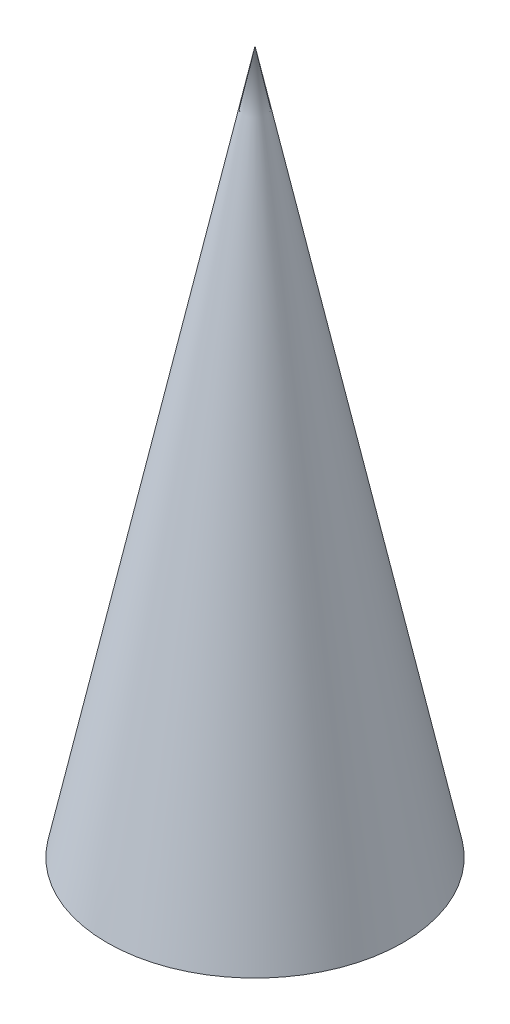
ISO-10303-21;
HEADER;
FILE_DESCRIPTION(('STEP AP214'),'2;1');
FILE_NAME('part.step','',(''),(''),'','','');
FILE_SCHEMA(('AUTOMOTIVE_DESIGN { 1 0 10303 214 1 1 1 1 }'));
ENDSEC;
DATA;
#1=APPLICATION_CONTEXT('core data for automotive mechanical design processes');
#2=APPLICATION_PROTOCOL_DEFINITION('international standard','automotive_design',2000,#1);
#3=PRODUCT_CONTEXT('',#1,'mechanical');
#4=PRODUCT('Part','Part','',(#3));
#5=PRODUCT_RELATED_PRODUCT_CATEGORY('part','',(#4));
#6=PRODUCT_DEFINITION_FORMATION('','',#4);
#7=PRODUCT_DEFINITION_CONTEXT('part definition',#1,'design');
#8=PRODUCT_DEFINITION('design','',#6,#7);
#9=PRODUCT_DEFINITION_SHAPE('','',#8);
#10=(LENGTH_UNIT() NAMED_UNIT(*) SI_UNIT(.MILLI.,.METRE.));
#11=(NAMED_UNIT(*) PLANE_ANGLE_UNIT() SI_UNIT($,.RADIAN.));
#12=(NAMED_UNIT(*) SI_UNIT($,.STERADIAN.) SOLID_ANGLE_UNIT());
#13=UNCERTAINTY_MEASURE_WITH_UNIT(LENGTH_MEASURE(1.E-05),#10,'distance_accuracy_value','');
#14=(GEOMETRIC_REPRESENTATION_CONTEXT(3) GLOBAL_UNCERTAINTY_ASSIGNED_CONTEXT((#13)) GLOBAL_UNIT_ASSIGNED_CONTEXT((#10,
#11,#12)) REPRESENTATION_CONTEXT('',''));
#15=CARTESIAN_POINT('',(0.,0.,0.));
#16=DIRECTION('',(0.,0.,1.));
#17=DIRECTION('',(1.,0.,0.));
#18=AXIS2_PLACEMENT_3D('',#15,#16,#17);
#19=CARTESIAN_POINT('',(0.,0.,0.));
#20=DIRECTION('',(0.,1.,0.));
#21=DIRECTION('',(0.,0.,1.));
#22=AXIS2_PLACEMENT_3D('',#19,#20,#21);
#23=PLANE('',#22);
#24=CARTESIAN_POINT('',(0.,0.,0.));
#25=DIRECTION('',(0.,1.,0.));
#26=DIRECTION('',(0.,0.,1.));
#27=AXIS2_PLACEMENT_3D('',#24,#25,#26);
#28=CIRCLE('',#27,40.);
#29=CARTESIAN_POINT('',(0.,0.,40.));
#30=VERTEX_POINT('',#29);
#31=EDGE_CURVE('E11',#30,#30,#28,.T.);
#32=ORIENTED_EDGE('',*,*,#31,.F.);
#33=EDGE_LOOP('',(#32));
#34=FACE_BOUND('',#33,.T.);
#35=ADVANCED_FACE('F30',(#34),#23,.F.);
#36=CARTESIAN_POINT('',(0.,-3.44169137633799E-12,0.));
#37=DIRECTION('',(0.,-1.,0.));
#38=DIRECTION('',(0.,0.,-1.));
#39=AXIS2_PLACEMENT_3D('',#36,#37,#38);
#40=CONICAL_SURFACE('',#39,40.0000000000001,0.207496226435199);
#41=ORIENTED_EDGE('',*,*,#31,.T.);
#42=EDGE_LOOP('',(#41));
#43=FACE_BOUND('',#42,.T.);
#44=CARTESIAN_POINT('',(0.,190.,0.));
#45=VERTEX_POINT('',#44);
#46=VERTEX_LOOP('',#45);
#47=FACE_BOUND('',#46,.T.);
#48=ADVANCED_FACE('F32',(#43,#47),#40,.T.);
#49=CLOSED_SHELL('',(#35,#48));
#50=MANIFOLD_SOLID_BREP('B2',#49);
#51=ADVANCED_BREP_SHAPE_REPRESENTATION('',(#18,#50),#14);
#52=SHAPE_DEFINITION_REPRESENTATION(#9,#51);
ENDSEC;
END-ISO-10303-21;
